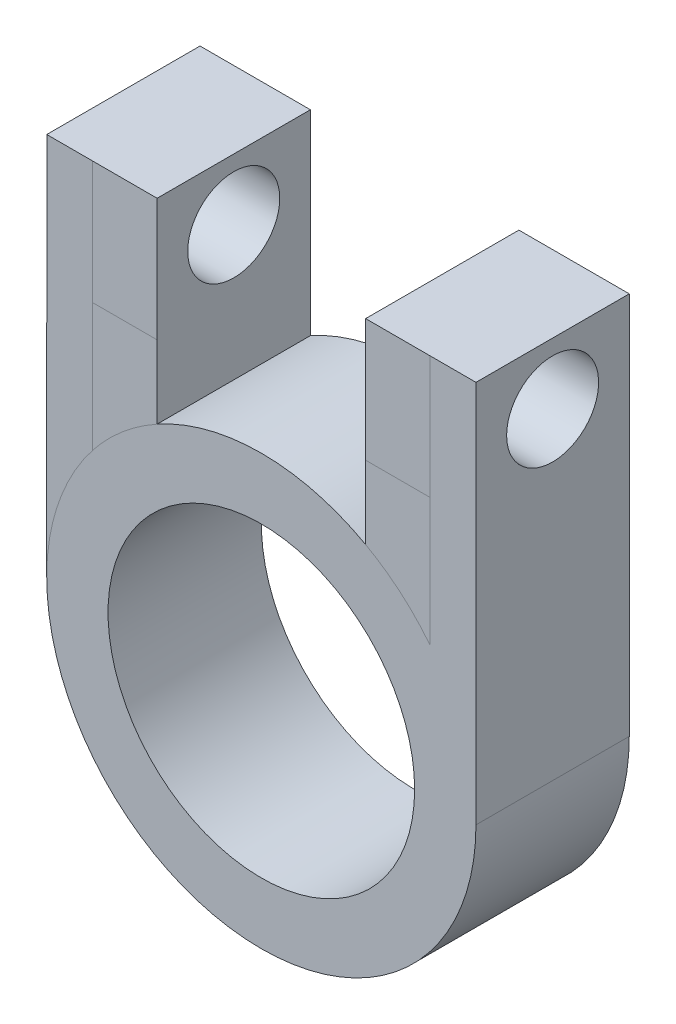
ISO-10303-21;
HEADER;
FILE_DESCRIPTION(('STEP AP214'),'2;1');
FILE_NAME('part.step','',(''),(''),'','','');
FILE_SCHEMA(('AUTOMOTIVE_DESIGN { 1 0 10303 214 1 1 1 1 }'));
ENDSEC;
DATA;
#1=APPLICATION_CONTEXT('core data for automotive mechanical design processes');
#2=APPLICATION_PROTOCOL_DEFINITION('international standard','automotive_design',2000,#1);
#3=PRODUCT_CONTEXT('',#1,'mechanical');
#4=PRODUCT('Part','Part','',(#3));
#5=PRODUCT_RELATED_PRODUCT_CATEGORY('part','',(#4));
#6=PRODUCT_DEFINITION_FORMATION('','',#4);
#7=PRODUCT_DEFINITION_CONTEXT('part definition',#1,'design');
#8=PRODUCT_DEFINITION('design','',#6,#7);
#9=PRODUCT_DEFINITION_SHAPE('','',#8);
#10=(LENGTH_UNIT() NAMED_UNIT(*) SI_UNIT(.MILLI.,.METRE.));
#11=(NAMED_UNIT(*) PLANE_ANGLE_UNIT() SI_UNIT($,.RADIAN.));
#12=(NAMED_UNIT(*) SI_UNIT($,.STERADIAN.) SOLID_ANGLE_UNIT());
#13=UNCERTAINTY_MEASURE_WITH_UNIT(LENGTH_MEASURE(1.E-05),#10,'distance_accuracy_value','');
#14=(GEOMETRIC_REPRESENTATION_CONTEXT(3) GLOBAL_UNCERTAINTY_ASSIGNED_CONTEXT((#13)) GLOBAL_UNIT_ASSIGNED_CONTEXT((#10,
#11,#12)) REPRESENTATION_CONTEXT('',''));
#15=CARTESIAN_POINT('',(0.,0.,0.));
#16=DIRECTION('',(0.,0.,1.));
#17=DIRECTION('',(1.,0.,0.));
#18=AXIS2_PLACEMENT_3D('',#15,#16,#17);
#19=CARTESIAN_POINT('',(0.,0.,10.));
#20=DIRECTION('',(0.,0.,-1.));
#21=DIRECTION('',(-1.,0.,0.));
#22=AXIS2_PLACEMENT_3D('',#19,#20,#21);
#23=CYLINDRICAL_SURFACE('',#22,14.);
#24=DIRECTION('',(0.,0.,-1.));
#25=VECTOR('',#24,1.);
#26=CARTESIAN_POINT('',(-6.8,12.2376468326227,10.));
#27=LINE('',#26,#25);
#28=CARTESIAN_POINT('',(-6.79980892208728,12.2378382614243,10.));
#29=VERTEX_POINT('',#28);
#30=CARTESIAN_POINT('',(-6.8,12.2376468326227,0.));
#31=VERTEX_POINT('',#30);
#32=EDGE_CURVE('E75',#29,#31,#27,.T.);
#33=ORIENTED_EDGE('',*,*,#32,.F.);
#34=CARTESIAN_POINT('',(0.,0.,10.));
#35=DIRECTION('',(0.,0.,-1.));
#36=DIRECTION('',(-1.,0.,0.));
#37=AXIS2_PLACEMENT_3D('',#34,#35,#36);
#38=CIRCLE('',#37,14.);
#39=CARTESIAN_POINT('',(6.79989151715675,12.2379183985312,9.99893299634907));
#40=VERTEX_POINT('',#39);
#41=EDGE_CURVE('E66',#40,#29,#38,.F.);
#42=ORIENTED_EDGE('',*,*,#41,.F.);
#43=DIRECTION('',(0.,0.,-1.));
#44=VECTOR('',#43,1.);
#45=CARTESIAN_POINT('',(6.8,12.2376468326227,10.));
#46=LINE('',#45,#44);
#47=CARTESIAN_POINT('',(6.8,12.2376468326227,0.));
#48=VERTEX_POINT('',#47);
#49=EDGE_CURVE('E163',#48,#40,#46,.F.);
#50=ORIENTED_EDGE('',*,*,#49,.F.);
#51=CARTESIAN_POINT('',(0.,0.,0.));
#52=DIRECTION('',(0.,0.,1.));
#53=DIRECTION('',(1.,0.,0.));
#54=AXIS2_PLACEMENT_3D('',#51,#52,#53);
#55=CIRCLE('',#54,14.);
#56=EDGE_CURVE('E454',#48,#31,#55,.T.);
#57=ORIENTED_EDGE('',*,*,#56,.T.);
#58=EDGE_LOOP('',(#33,#42,#50,#57));
#59=FACE_BOUND('',#58,.T.);
#60=ADVANCED_FACE('F57',(#59),#23,.T.);
#61=DIRECTION('',(0.,0.,1.));
#62=VECTOR('',#61,1.);
#63=CARTESIAN_POINT('',(-14.,0.,0.));
#64=LINE('',#63,#62);
#65=CARTESIAN_POINT('',(-14.,0.,0.));
#66=VERTEX_POINT('',#65);
#67=CARTESIAN_POINT('',(-14.0000000016616,-0.000180479200535884,9.99920493200666));
#68=VERTEX_POINT('',#67);
#69=EDGE_CURVE('E406',#66,#68,#64,.T.);
#70=ORIENTED_EDGE('',*,*,#69,.F.);
#71=CARTESIAN_POINT('',(14.,0.,0.));
#72=VERTEX_POINT('',#71);
#73=EDGE_CURVE('E450',#66,#72,#55,.T.);
#74=ORIENTED_EDGE('',*,*,#73,.T.);
#75=DIRECTION('',(0.,0.,-1.));
#76=VECTOR('',#75,1.);
#77=CARTESIAN_POINT('',(14.,0.,10.));
#78=LINE('',#77,#76);
#79=CARTESIAN_POINT('',(14.,0.,10.));
#80=VERTEX_POINT('',#79);
#81=EDGE_CURVE('E404',#80,#72,#78,.T.);
#82=ORIENTED_EDGE('',*,*,#81,.F.);
#83=CARTESIAN_POINT('',(0.,0.,10.));
#84=DIRECTION('',(0.,0.,-1.));
#85=DIRECTION('',(-1.,0.,0.));
#86=AXIS2_PLACEMENT_3D('',#83,#84,#85);
#87=CIRCLE('',#86,14.);
#88=EDGE_CURVE('E405',#68,#80,#87,.F.);
#89=ORIENTED_EDGE('',*,*,#88,.F.);
#90=EDGE_LOOP('',(#70,#74,#82,#89));
#91=FACE_BOUND('',#90,.T.);
#92=ADVANCED_FACE('F367',(#91),#23,.T.);
#93=CARTESIAN_POINT('',(0.,0.,10.));
#94=DIRECTION('',(0.,0.,1.));
#95=DIRECTION('',(1.,0.,0.));
#96=AXIS2_PLACEMENT_3D('',#93,#94,#95);
#97=PLANE('',#96);
#98=CARTESIAN_POINT('',(-6.79979082445857,12.2377630612628,10.));
#99=CARTESIAN_POINT('',(-9.25886741946117,10.871401710448,10.));
#100=CARTESIAN_POINT('',(-10.9992617658411,8.66119163894363,10.));
#101=B_SPLINE_CURVE_WITH_KNOTS('',2,(#98,#99,#100),.UNSPECIFIED.,.F.,.F.,(3,3),(0.,1.),.UNSPECIFIED.);
#102=CARTESIAN_POINT('',(-11.,8.66130418159378,9.99882129523331));
#103=VERTEX_POINT('',#102);
#104=EDGE_CURVE('E395',#29,#103,#101,.T.);
#105=ORIENTED_EDGE('',*,*,#104,.T.);
#106=CARTESIAN_POINT('',(-11.0007383169432,8.66235432534319,10.));
#107=CARTESIAN_POINT('',(-11.160802001548,8.45967046296209,10.));
#108=CARTESIAN_POINT('',(-11.3151489608895,8.25247109390551,10.));
#109=CARTESIAN_POINT('',(-11.6117523196383,7.82997659397905,10.));
#110=CARTESIAN_POINT('',(-11.7540235023026,7.61469184124667,10.));
#111=CARTESIAN_POINT('',(-12.0264807138246,7.17603228117077,10.));
#112=CARTESIAN_POINT('',(-12.1566429081268,6.95264267327678,10.));
#113=CARTESIAN_POINT('',(-12.4049302320983,6.49780005993228,10.));
#114=CARTESIAN_POINT('',(-12.5229909502534,6.26631189886119,10.));
#115=CARTESIAN_POINT('',(-12.7402820206452,5.80965973912689,10.));
#116=CARTESIAN_POINT('',(-12.8401791544906,5.58481197971855,10.));
#117=CARTESIAN_POINT('',(-13.0404623540027,5.10132041109898,10.));
#118=CARTESIAN_POINT('',(-13.1392834929058,4.84202591045459,10.));
#119=CARTESIAN_POINT('',(-13.3156061332016,4.33494434353209,10.));
#120=CARTESIAN_POINT('',(-13.3940709380417,4.08749200831077,10.));
#121=CARTESIAN_POINT('',(-13.5366599735844,3.58970597297491,10.));
#122=CARTESIAN_POINT('',(-13.6008480477493,3.33939058824611,10.));
#123=CARTESIAN_POINT('',(-13.7149230711543,2.83589908586689,10.));
#124=CARTESIAN_POINT('',(-13.7648303746521,2.58272757977978,10.));
#125=CARTESIAN_POINT('',(-13.8503889252844,2.07353365085075,10.));
#126=CARTESIAN_POINT('',(-13.8860152437743,1.81750703773817,10.));
#127=CARTESIAN_POINT('',(-13.9430573394628,1.30262082574351,10.));
#128=CARTESIAN_POINT('',(-13.9644028374873,1.04375349710712,10.));
#129=CARTESIAN_POINT('',(-13.9929237424627,0.523241975929609,10.));
#130=CARTESIAN_POINT('',(-13.9999901903662,0.261591634072426,10.));
#131=CARTESIAN_POINT('',(-14.000000003404,-9.077473572696E-05,10.));
#132=CARTESIAN_POINT('',(-14.0000000059583,-0.000181549464386309,10.));
#133=CARTESIAN_POINT('',(-14.0000000076629,-0.000272324185956787,10.));
#134=B_SPLINE_CURVE_WITH_KNOTS('',3,(#106,#107,#108,#109,#110,#111,#112,#113,#114,#115,#116,
#117,#118,#119,#120,#121,#122,#123,#124,#125,#126,#127,#128,#129,#130,#131,#132,#133),
.UNSPECIFIED.,.F.,.F.,(4,2,2,2,2,2,2,2,2,2,2,2,2,4),(0.,0.77469621467779,1.54842993428858,
2.32365575123851,3.10281415634297,3.84062717168678,4.67260912275803,5.45099539328752,
6.22582753707812,6.9995497550154,7.77461674862613,8.55347050461379,9.33824534596899,
9.33851767015505),.UNSPECIFIED.);
#135=EDGE_CURVE('E161',#103,#68,#134,.T.);
#136=ORIENTED_EDGE('',*,*,#135,.T.);
#137=ORIENTED_EDGE('',*,*,#88,.T.);
#138=DIRECTION('',(0.,-1.,0.));
#139=VECTOR('',#138,1.);
#140=CARTESIAN_POINT('',(14.,25.,10.));
#141=LINE('',#140,#139);
#142=CARTESIAN_POINT('',(14.,25.,10.));
#143=VERTEX_POINT('',#142);
#144=EDGE_CURVE('E408',#143,#80,#141,.T.);
#145=ORIENTED_EDGE('',*,*,#144,.F.);
#146=DIRECTION('',(1.,0.,0.));
#147=VECTOR('',#146,1.);
#148=CARTESIAN_POINT('',(14.,25.,10.));
#149=LINE('',#148,#147);
#150=CARTESIAN_POINT('',(11.,25.,9.9988212952333));
#151=VERTEX_POINT('',#150);
#152=EDGE_CURVE('E356',#151,#143,#149,.T.);
#153=ORIENTED_EDGE('',*,*,#152,.F.);
#154=CARTESIAN_POINT('',(11.,25.,10.));
#155=DIRECTION('',(0.,-1.,0.));
#156=VECTOR('',#155,1.);
#157=LINE('',#154,#156);
#158=CARTESIAN_POINT('',(11.,17.,9.9988212952333));
#159=VERTEX_POINT('',#158);
#160=EDGE_CURVE('E353',#151,#159,#157,.T.);
#161=ORIENTED_EDGE('',*,*,#160,.T.);
#162=CARTESIAN_POINT('',(11.,17.,10.));
#163=DIRECTION('',(0.,-1.,0.));
#164=VECTOR('',#163,1.);
#165=LINE('',#162,#164);
#166=CARTESIAN_POINT('',(11.0000000095196,8.66117260987094,9.99909574375117));
#167=VERTEX_POINT('',#166);
#168=EDGE_CURVE('E152',#159,#167,#165,.T.);
#169=ORIENTED_EDGE('',*,*,#168,.T.);
#170=CARTESIAN_POINT('',(10.9992757489141,8.66117388114048,10.));
#171=CARTESIAN_POINT('',(9.25888174342821,10.8713908610559,10.));
#172=CARTESIAN_POINT('',(6.79980181546569,12.237756954213,10.));
#173=B_SPLINE_CURVE_WITH_KNOTS('',2,(#170,#171,#172),.UNSPECIFIED.,.F.,.F.,(3,3),(0.,1.),.UNSPECIFIED.);
#174=EDGE_CURVE('E12',#167,#40,#173,.T.);
#175=ORIENTED_EDGE('',*,*,#174,.T.);
#176=ORIENTED_EDGE('',*,*,#41,.T.);
#177=EDGE_LOOP('',(#105,#136,#137,#145,#153,#161,#169,#175,#176));
#178=FACE_BOUND('',#177,.T.);
#179=CARTESIAN_POINT('',(0.,0.,10.));
#180=DIRECTION('',(0.,0.,1.));
#181=DIRECTION('',(1.,0.,0.));
#182=AXIS2_PLACEMENT_3D('',#179,#180,#181);
#183=CIRCLE('',#182,10.);
#184=CARTESIAN_POINT('',(10.,0.,10.));
#185=VERTEX_POINT('',#184);
#186=EDGE_CURVE('E451',#185,#185,#183,.T.);
#187=ORIENTED_EDGE('',*,*,#186,.F.);
#188=EDGE_LOOP('',(#187));
#189=FACE_BOUND('',#188,.T.);
#190=ADVANCED_FACE('F147',(#178,#189),#97,.T.);
#191=CARTESIAN_POINT('',(0.,0.,0.));
#192=DIRECTION('',(0.,0.,1.));
#193=DIRECTION('',(1.,0.,0.));
#194=AXIS2_PLACEMENT_3D('',#191,#192,#193);
#195=PLANE('',#194);
#196=DIRECTION('',(0.,-1.,0.));
#197=VECTOR('',#196,1.);
#198=CARTESIAN_POINT('',(-6.8,25.,0.));
#199=LINE('',#198,#197);
#200=CARTESIAN_POINT('',(-6.8,25.,0.));
#201=VERTEX_POINT('',#200);
#202=EDGE_CURVE('E247',#201,#31,#199,.T.);
#203=ORIENTED_EDGE('',*,*,#202,.T.);
#204=ORIENTED_EDGE('',*,*,#56,.F.);
#205=DIRECTION('',(0.,-1.,0.));
#206=VECTOR('',#205,1.);
#207=CARTESIAN_POINT('',(6.8,25.,0.));
#208=LINE('',#207,#206);
#209=CARTESIAN_POINT('',(6.8,25.,0.));
#210=VERTEX_POINT('',#209);
#211=EDGE_CURVE('E84',#210,#48,#208,.T.);
#212=ORIENTED_EDGE('',*,*,#211,.F.);
#213=DIRECTION('',(-1.,0.,0.));
#214=VECTOR('',#213,1.);
#215=CARTESIAN_POINT('',(14.,25.,0.));
#216=LINE('',#215,#214);
#217=CARTESIAN_POINT('',(14.,25.,0.));
#218=VERTEX_POINT('',#217);
#219=EDGE_CURVE('E423',#218,#210,#216,.T.);
#220=ORIENTED_EDGE('',*,*,#219,.F.);
#221=DIRECTION('',(0.,-1.,0.));
#222=VECTOR('',#221,1.);
#223=CARTESIAN_POINT('',(14.,25.,0.));
#224=LINE('',#223,#222);
#225=EDGE_CURVE('E421',#218,#72,#224,.T.);
#226=ORIENTED_EDGE('',*,*,#225,.T.);
#227=ORIENTED_EDGE('',*,*,#73,.F.);
#228=DIRECTION('',(0.,-1.,0.));
#229=VECTOR('',#228,1.);
#230=CARTESIAN_POINT('',(-14.,25.,0.));
#231=LINE('',#230,#229);
#232=CARTESIAN_POINT('',(-14.,25.,0.));
#233=VERTEX_POINT('',#232);
#234=EDGE_CURVE('E430',#233,#66,#231,.T.);
#235=ORIENTED_EDGE('',*,*,#234,.F.);
#236=DIRECTION('',(-1.,0.,0.));
#237=VECTOR('',#236,1.);
#238=CARTESIAN_POINT('',(-14.,25.,0.));
#239=LINE('',#238,#237);
#240=EDGE_CURVE('E347',#201,#233,#239,.T.);
#241=ORIENTED_EDGE('',*,*,#240,.F.);
#242=EDGE_LOOP('',(#203,#204,#212,#220,#226,#227,#235,#241));
#243=FACE_BOUND('',#242,.T.);
#244=CARTESIAN_POINT('',(0.,0.,0.));
#245=DIRECTION('',(0.,0.,1.));
#246=DIRECTION('',(1.,0.,0.));
#247=AXIS2_PLACEMENT_3D('',#244,#245,#246);
#248=CIRCLE('',#247,10.);
#249=CARTESIAN_POINT('',(10.,0.,0.));
#250=VERTEX_POINT('',#249);
#251=EDGE_CURVE('E420',#250,#250,#248,.T.);
#252=ORIENTED_EDGE('',*,*,#251,.T.);
#253=EDGE_LOOP('',(#252));
#254=FACE_BOUND('',#253,.T.);
#255=ADVANCED_FACE('F368',(#243,#254),#195,.F.);
#256=CARTESIAN_POINT('',(0.,0.,10.));
#257=DIRECTION('',(0.,0.,-1.));
#258=DIRECTION('',(-1.,0.,0.));
#259=AXIS2_PLACEMENT_3D('',#256,#257,#258);
#260=CYLINDRICAL_SURFACE('',#259,10.);
#261=ORIENTED_EDGE('',*,*,#186,.T.);
#262=EDGE_LOOP('',(#261));
#263=FACE_BOUND('',#262,.T.);
#264=ORIENTED_EDGE('',*,*,#251,.F.);
#265=EDGE_LOOP('',(#264));
#266=FACE_BOUND('',#265,.T.);
#267=ADVANCED_FACE('F369',(#263,#266),#260,.F.);
#268=CARTESIAN_POINT('',(14.,25.,10.));
#269=DIRECTION('',(-1.,0.,0.));
#270=DIRECTION('',(0.,0.,1.));
#271=AXIS2_PLACEMENT_3D('',#268,#269,#270);
#272=PLANE('',#271);
#273=CARTESIAN_POINT('',(14.,21.,5.));
#274=DIRECTION('',(-1.,0.,0.));
#275=DIRECTION('',(0.,0.,1.));
#276=AXIS2_PLACEMENT_3D('',#273,#274,#275);
#277=CIRCLE('',#276,3.);
#278=CARTESIAN_POINT('',(14.,21.,8.));
#279=VERTEX_POINT('',#278);
#280=EDGE_CURVE('E428',#279,#279,#277,.T.);
#281=ORIENTED_EDGE('',*,*,#280,.T.);
#282=EDGE_LOOP('',(#281));
#283=FACE_BOUND('',#282,.T.);
#284=ORIENTED_EDGE('',*,*,#81,.T.);
#285=ORIENTED_EDGE('',*,*,#225,.F.);
#286=DIRECTION('',(0.,0.,-1.));
#287=VECTOR('',#286,1.);
#288=CARTESIAN_POINT('',(14.,25.,10.));
#289=LINE('',#288,#287);
#290=EDGE_CURVE('E410',#143,#218,#289,.T.);
#291=ORIENTED_EDGE('',*,*,#290,.F.);
#292=ORIENTED_EDGE('',*,*,#144,.T.);
#293=EDGE_LOOP('',(#284,#285,#291,#292));
#294=FACE_BOUND('',#293,.T.);
#295=ADVANCED_FACE('F457',(#283,#294),#272,.F.);
#296=CARTESIAN_POINT('',(0.,25.,0.));
#297=DIRECTION('',(0.,1.,0.));
#298=DIRECTION('',(0.,0.,1.));
#299=AXIS2_PLACEMENT_3D('',#296,#297,#298);
#300=PLANE('',#299);
#301=ORIENTED_EDGE('',*,*,#290,.T.);
#302=ORIENTED_EDGE('',*,*,#219,.T.);
#303=DIRECTION('',(0.,0.,-1.));
#304=VECTOR('',#303,1.);
#305=CARTESIAN_POINT('',(6.8,25.,9.99764259046661));
#306=LINE('',#305,#304);
#307=CARTESIAN_POINT('',(6.8,25.,9.99764259046661));
#308=VERTEX_POINT('',#307);
#309=EDGE_CURVE('E636',#308,#210,#306,.T.);
#310=ORIENTED_EDGE('',*,*,#309,.F.);
#311=DIRECTION('',(1.,0.,0.));
#312=VECTOR('',#311,1.);
#313=CARTESIAN_POINT('',(6.8,25.,9.99764259046661));
#314=LINE('',#313,#312);
#315=EDGE_CURVE('E281',#308,#151,#314,.T.);
#316=ORIENTED_EDGE('',*,*,#315,.T.);
#317=ORIENTED_EDGE('',*,*,#152,.T.);
#318=EDGE_LOOP('',(#301,#302,#310,#316,#317));
#319=FACE_BOUND('',#318,.T.);
#320=ADVANCED_FACE('F322',(#319),#300,.T.);
#321=CARTESIAN_POINT('',(-14.,25.,9.99764259046662));
#322=DIRECTION('',(0.,0.,-1.));
#323=DIRECTION('',(-1.,0.,0.));
#324=AXIS2_PLACEMENT_3D('',#321,#322,#323);
#325=PLANE('',#324);
#326=ORIENTED_EDGE('',*,*,#135,.F.);
#327=CARTESIAN_POINT('',(-11.,17.,9.99882129523331));
#328=DIRECTION('',(0.,-1.,0.));
#329=VECTOR('',#328,1.);
#330=LINE('',#327,#329);
#331=CARTESIAN_POINT('',(-11.,17.,9.99882129523331));
#332=VERTEX_POINT('',#331);
#333=EDGE_CURVE('E233',#332,#103,#330,.T.);
#334=ORIENTED_EDGE('',*,*,#333,.F.);
#335=CARTESIAN_POINT('',(-11.,25.,10.));
#336=DIRECTION('',(0.,-1.,0.));
#337=VECTOR('',#336,1.);
#338=LINE('',#335,#337);
#339=CARTESIAN_POINT('',(-11.,25.,9.99882129523331));
#340=VERTEX_POINT('',#339);
#341=EDGE_CURVE('E300',#340,#332,#338,.T.);
#342=ORIENTED_EDGE('',*,*,#341,.F.);
#343=DIRECTION('',(1.,0.,0.));
#344=VECTOR('',#343,1.);
#345=CARTESIAN_POINT('',(-14.,25.,9.99764259046662));
#346=LINE('',#345,#344);
#347=CARTESIAN_POINT('',(-14.,25.,9.99764259046662));
#348=VERTEX_POINT('',#347);
#349=EDGE_CURVE('E341',#348,#340,#346,.T.);
#350=ORIENTED_EDGE('',*,*,#349,.F.);
#351=DIRECTION('',(0.,-1.,0.));
#352=VECTOR('',#351,1.);
#353=CARTESIAN_POINT('',(-14.,25.,9.99764259046662));
#354=LINE('',#353,#352);
#355=EDGE_CURVE('E397',#348,#68,#354,.T.);
#356=ORIENTED_EDGE('',*,*,#355,.T.);
#357=EDGE_LOOP('',(#326,#334,#342,#350,#356));
#358=FACE_BOUND('',#357,.T.);
#359=ADVANCED_FACE('F324',(#358),#325,.F.);
#360=CARTESIAN_POINT('',(-14.,25.,0.));
#361=DIRECTION('',(1.,0.,0.));
#362=DIRECTION('',(0.,0.,-1.));
#363=AXIS2_PLACEMENT_3D('',#360,#361,#362);
#364=PLANE('',#363);
#365=CARTESIAN_POINT('',(-14.,21.,5.));
#366=DIRECTION('',(-1.,0.,0.));
#367=DIRECTION('',(0.,0.,1.));
#368=AXIS2_PLACEMENT_3D('',#365,#366,#367);
#369=CIRCLE('',#368,3.);
#370=CARTESIAN_POINT('',(-14.,21.,8.));
#371=VERTEX_POINT('',#370);
#372=EDGE_CURVE('E241',#371,#371,#369,.T.);
#373=ORIENTED_EDGE('',*,*,#372,.F.);
#374=EDGE_LOOP('',(#373));
#375=FACE_BOUND('',#374,.T.);
#376=ORIENTED_EDGE('',*,*,#69,.T.);
#377=ORIENTED_EDGE('',*,*,#355,.F.);
#378=DIRECTION('',(0.,0.,1.));
#379=VECTOR('',#378,1.);
#380=CARTESIAN_POINT('',(-14.,25.,0.));
#381=LINE('',#380,#379);
#382=EDGE_CURVE('E349',#233,#348,#381,.T.);
#383=ORIENTED_EDGE('',*,*,#382,.F.);
#384=ORIENTED_EDGE('',*,*,#234,.T.);
#385=EDGE_LOOP('',(#376,#377,#383,#384));
#386=FACE_BOUND('',#385,.T.);
#387=ADVANCED_FACE('F316',(#375,#386),#364,.F.);
#388=CARTESIAN_POINT('',(0.,25.,0.));
#389=DIRECTION('',(0.,1.,0.));
#390=DIRECTION('',(0.,0.,1.));
#391=AXIS2_PLACEMENT_3D('',#388,#389,#390);
#392=PLANE('',#391);
#393=ORIENTED_EDGE('',*,*,#382,.T.);
#394=ORIENTED_EDGE('',*,*,#349,.T.);
#395=DIRECTION('',(-1.,0.,0.));
#396=VECTOR('',#395,1.);
#397=CARTESIAN_POINT('',(-6.8,25.,10.));
#398=LINE('',#397,#396);
#399=CARTESIAN_POINT('',(-6.8,25.,10.));
#400=VERTEX_POINT('',#399);
#401=EDGE_CURVE('E238',#400,#340,#398,.T.);
#402=ORIENTED_EDGE('',*,*,#401,.F.);
#403=DIRECTION('',(0.,0.,-1.));
#404=VECTOR('',#403,1.);
#405=CARTESIAN_POINT('',(-6.8,25.,10.));
#406=LINE('',#405,#404);
#407=EDGE_CURVE('E243',#400,#201,#406,.T.);
#408=ORIENTED_EDGE('',*,*,#407,.T.);
#409=ORIENTED_EDGE('',*,*,#240,.T.);
#410=EDGE_LOOP('',(#393,#394,#402,#408,#409));
#411=FACE_BOUND('',#410,.T.);
#412=ADVANCED_FACE('F317',(#411),#392,.T.);
#413=CARTESIAN_POINT('',(19.,21.,5.));
#414=DIRECTION('',(-1.,0.,0.));
#415=DIRECTION('',(0.,0.,1.));
#416=AXIS2_PLACEMENT_3D('',#413,#414,#415);
#417=CYLINDRICAL_SURFACE('',#416,3.);
#418=ORIENTED_EDGE('',*,*,#372,.T.);
#419=EDGE_LOOP('',(#418));
#420=FACE_BOUND('',#419,.T.);
#421=CARTESIAN_POINT('',(-6.8,21.,5.));
#422=DIRECTION('',(1.,0.,0.));
#423=DIRECTION('',(0.,0.,-1.));
#424=AXIS2_PLACEMENT_3D('',#421,#422,#423);
#425=CIRCLE('',#424,3.);
#426=CARTESIAN_POINT('',(-6.8,21.,2.));
#427=VERTEX_POINT('',#426);
#428=EDGE_CURVE('E288',#427,#427,#425,.T.);
#429=ORIENTED_EDGE('',*,*,#428,.T.);
#430=EDGE_LOOP('',(#429));
#431=FACE_BOUND('',#430,.T.);
#432=ADVANCED_FACE('F313',(#420,#431),#417,.F.);
#433=ORIENTED_EDGE('',*,*,#280,.F.);
#434=EDGE_LOOP('',(#433));
#435=FACE_BOUND('',#434,.T.);
#436=CARTESIAN_POINT('',(6.8,21.,4.99999999999999));
#437=DIRECTION('',(-1.,0.,0.));
#438=DIRECTION('',(0.,0.,1.));
#439=AXIS2_PLACEMENT_3D('',#436,#437,#438);
#440=CIRCLE('',#439,3.);
#441=CARTESIAN_POINT('',(6.8,21.,7.99999999999999));
#442=VERTEX_POINT('',#441);
#443=EDGE_CURVE('E396',#442,#442,#440,.T.);
#444=ORIENTED_EDGE('',*,*,#443,.T.);
#445=EDGE_LOOP('',(#444));
#446=FACE_BOUND('',#445,.T.);
#447=ADVANCED_FACE('F309',(#435,#446),#417,.F.);
#448=CARTESIAN_POINT('',(-6.8,0.,0.));
#449=DIRECTION('',(-1.,0.,0.));
#450=DIRECTION('',(0.,0.,1.));
#451=AXIS2_PLACEMENT_3D('',#448,#449,#450);
#452=PLANE('',#451);
#453=DIRECTION('',(0.,-1.,0.));
#454=VECTOR('',#453,1.);
#455=CARTESIAN_POINT('',(-6.8,25.,10.));
#456=LINE('',#455,#454);
#457=CARTESIAN_POINT('',(-6.8,17.,10.));
#458=VERTEX_POINT('',#457);
#459=EDGE_CURVE('E237',#400,#458,#456,.T.);
#460=ORIENTED_EDGE('',*,*,#459,.T.);
#461=DIRECTION('',(0.,1.,0.));
#462=VECTOR('',#461,1.);
#463=CARTESIAN_POINT('',(-6.8,8.5,10.));
#464=LINE('',#463,#462);
#465=EDGE_CURVE('E167',#29,#458,#464,.T.);
#466=ORIENTED_EDGE('',*,*,#465,.F.);
#467=ORIENTED_EDGE('',*,*,#32,.T.);
#468=ORIENTED_EDGE('',*,*,#202,.F.);
#469=ORIENTED_EDGE('',*,*,#407,.F.);
#470=EDGE_LOOP('',(#460,#466,#467,#468,#469));
#471=FACE_BOUND('',#470,.T.);
#472=ORIENTED_EDGE('',*,*,#428,.F.);
#473=EDGE_LOOP('',(#472));
#474=FACE_BOUND('',#473,.T.);
#475=ADVANCED_FACE('F271',(#471,#474),#452,.F.);
#476=CARTESIAN_POINT('',(-6.8,25.,10.));
#477=DIRECTION('',(0.,0.,-1.));
#478=DIRECTION('',(0.,1.,0.));
#479=AXIS2_PLACEMENT_3D('',#476,#477,#478);
#480=PLANE('',#479);
#481=ORIENTED_EDGE('',*,*,#341,.T.);
#482=CARTESIAN_POINT('',(-6.8,17.,10.));
#483=DIRECTION('',(-0.999999960619477,0.,-0.00028064398101807));
#484=VECTOR('',#483,1.);
#485=LINE('',#482,#484);
#486=EDGE_CURVE('E229',#458,#332,#485,.T.);
#487=ORIENTED_EDGE('',*,*,#486,.F.);
#488=ORIENTED_EDGE('',*,*,#459,.F.);
#489=ORIENTED_EDGE('',*,*,#401,.T.);
#490=EDGE_LOOP('',(#481,#487,#488,#489));
#491=FACE_BOUND('',#490,.T.);
#492=ADVANCED_FACE('F301',(#491),#480,.F.);
#493=CARTESIAN_POINT('',(6.8,0.,0.));
#494=DIRECTION('',(1.,0.,0.));
#495=DIRECTION('',(0.,0.,-1.));
#496=AXIS2_PLACEMENT_3D('',#493,#494,#495);
#497=PLANE('',#496);
#498=DIRECTION('',(0.,1.,0.));
#499=VECTOR('',#498,1.);
#500=CARTESIAN_POINT('',(6.8,25.,9.99764259046661));
#501=LINE('',#500,#499);
#502=CARTESIAN_POINT('',(6.8,17.,9.99764259046661));
#503=VERTEX_POINT('',#502);
#504=EDGE_CURVE('E263',#503,#308,#501,.T.);
#505=ORIENTED_EDGE('',*,*,#504,.T.);
#506=ORIENTED_EDGE('',*,*,#309,.T.);
#507=ORIENTED_EDGE('',*,*,#211,.T.);
#508=ORIENTED_EDGE('',*,*,#49,.T.);
#509=DIRECTION('',(0.,1.,0.));
#510=VECTOR('',#509,1.);
#511=CARTESIAN_POINT('',(6.8,8.5,9.99764259046661));
#512=LINE('',#511,#510);
#513=EDGE_CURVE('E166',#40,#503,#512,.T.);
#514=ORIENTED_EDGE('',*,*,#513,.T.);
#515=EDGE_LOOP('',(#505,#506,#507,#508,#514));
#516=FACE_BOUND('',#515,.T.);
#517=ORIENTED_EDGE('',*,*,#443,.F.);
#518=EDGE_LOOP('',(#517));
#519=FACE_BOUND('',#518,.T.);
#520=ADVANCED_FACE('F168',(#516,#519),#497,.F.);
#521=CARTESIAN_POINT('',(6.8,25.,9.99764259046661));
#522=DIRECTION('',(0.,0.,-1.));
#523=DIRECTION('',(-1.,0.,0.));
#524=AXIS2_PLACEMENT_3D('',#521,#522,#523);
#525=PLANE('',#524);
#526=ORIENTED_EDGE('',*,*,#160,.F.);
#527=ORIENTED_EDGE('',*,*,#315,.F.);
#528=ORIENTED_EDGE('',*,*,#504,.F.);
#529=CARTESIAN_POINT('',(6.8,17.,9.99764259046661));
#530=DIRECTION('',(1.,0.,0.));
#531=VECTOR('',#530,1.);
#532=LINE('',#529,#531);
#533=EDGE_CURVE('E172',#503,#159,#532,.T.);
#534=ORIENTED_EDGE('',*,*,#533,.T.);
#535=EDGE_LOOP('',(#526,#527,#528,#534));
#536=FACE_BOUND('',#535,.T.);
#537=ADVANCED_FACE('F199',(#536),#525,.F.);
#538=CARTESIAN_POINT('',(11.,8.5,9.9988212952333));
#539=DIRECTION('',(0.00028064398101807,0.,-0.999999960619477));
#540=DIRECTION('',(-0.999999960619477,0.,-0.00028064398101807));
#541=AXIS2_PLACEMENT_3D('',#538,#539,#540);
#542=PLANE('',#541);
#543=ORIENTED_EDGE('',*,*,#174,.F.);
#544=ORIENTED_EDGE('',*,*,#168,.F.);
#545=ORIENTED_EDGE('',*,*,#533,.F.);
#546=ORIENTED_EDGE('',*,*,#513,.F.);
#547=EDGE_LOOP('',(#543,#544,#545,#546));
#548=FACE_BOUND('',#547,.T.);
#549=ADVANCED_FACE('F175',(#548),#542,.F.);
#550=CARTESIAN_POINT('',(-6.8,8.5,10.));
#551=DIRECTION('',(0.00028064398101807,0.,-0.999999960619477));
#552=DIRECTION('',(-0.999999960619477,0.,-0.00028064398101807));
#553=AXIS2_PLACEMENT_3D('',#550,#551,#552);
#554=PLANE('',#553);
#555=ORIENTED_EDGE('',*,*,#104,.F.);
#556=ORIENTED_EDGE('',*,*,#465,.T.);
#557=ORIENTED_EDGE('',*,*,#486,.T.);
#558=ORIENTED_EDGE('',*,*,#333,.T.);
#559=EDGE_LOOP('',(#555,#556,#557,#558));
#560=FACE_BOUND('',#559,.T.);
#561=ADVANCED_FACE('F197',(#560),#554,.F.);
#562=CLOSED_SHELL('',(#60,#92,#190,#255,#267,#295,#320,#359,#387,#412,#432,#447,#475,#492,#520,
#537,#549,#561));
#563=MANIFOLD_SOLID_BREP('B2',#562);
#564=ADVANCED_BREP_SHAPE_REPRESENTATION('',(#18,#563),#14);
#565=SHAPE_DEFINITION_REPRESENTATION(#9,#564);
ENDSEC;
END-ISO-10303-21;
